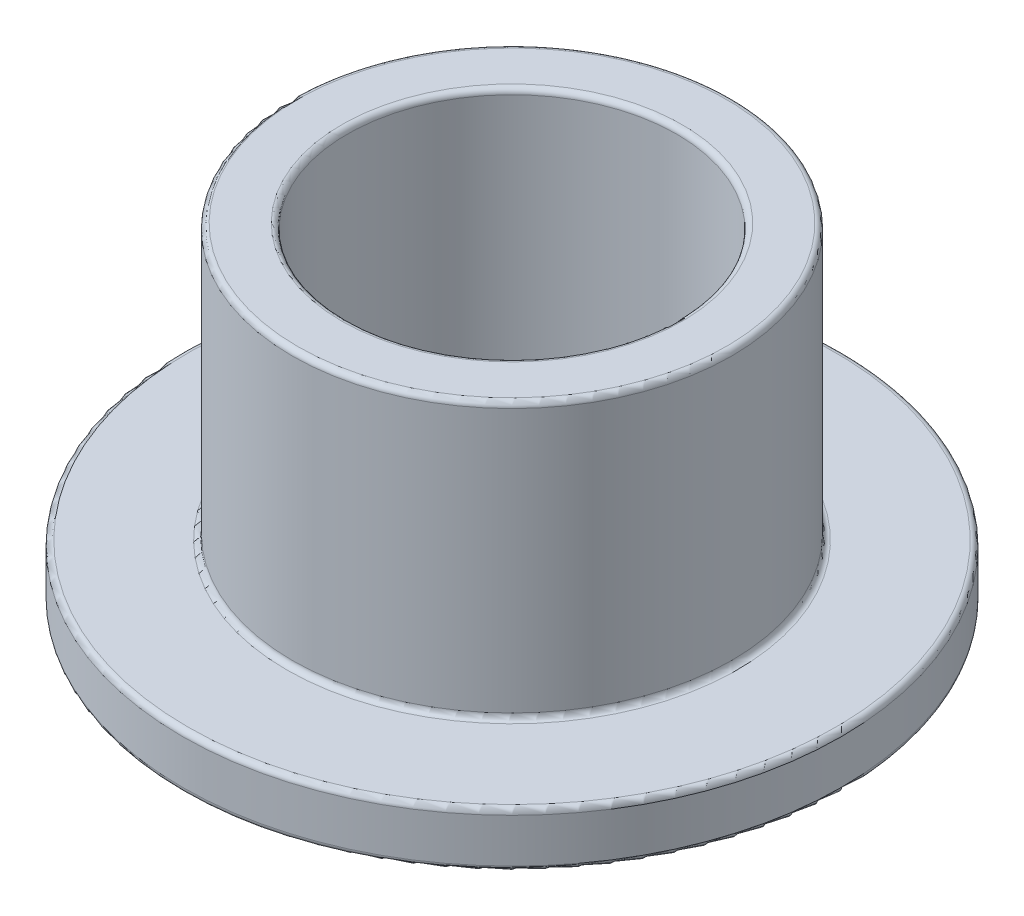
ISO-10303-21;
HEADER;
FILE_DESCRIPTION(('STEP AP214'),'2;1');
FILE_NAME('part.step','',(''),(''),'','','');
FILE_SCHEMA(('AUTOMOTIVE_DESIGN { 1 0 10303 214 1 1 1 1 }'));
ENDSEC;
DATA;
#1=APPLICATION_CONTEXT('core data for automotive mechanical design processes');
#2=APPLICATION_PROTOCOL_DEFINITION('international standard','automotive_design',2000,#1);
#3=PRODUCT_CONTEXT('',#1,'mechanical');
#4=PRODUCT('Part','Part','',(#3));
#5=PRODUCT_RELATED_PRODUCT_CATEGORY('part','',(#4));
#6=PRODUCT_DEFINITION_FORMATION('','',#4);
#7=PRODUCT_DEFINITION_CONTEXT('part definition',#1,'design');
#8=PRODUCT_DEFINITION('design','',#6,#7);
#9=PRODUCT_DEFINITION_SHAPE('','',#8);
#10=(LENGTH_UNIT() NAMED_UNIT(*) SI_UNIT(.MILLI.,.METRE.));
#11=(NAMED_UNIT(*) PLANE_ANGLE_UNIT() SI_UNIT($,.RADIAN.));
#12=(NAMED_UNIT(*) SI_UNIT($,.STERADIAN.) SOLID_ANGLE_UNIT());
#13=UNCERTAINTY_MEASURE_WITH_UNIT(LENGTH_MEASURE(1.E-05),#10,'distance_accuracy_value','');
#14=(GEOMETRIC_REPRESENTATION_CONTEXT(3) GLOBAL_UNCERTAINTY_ASSIGNED_CONTEXT((#13)) GLOBAL_UNIT_ASSIGNED_CONTEXT((#10,
#11,#12)) REPRESENTATION_CONTEXT('',''));
#15=CARTESIAN_POINT('',(0.,0.,0.));
#16=DIRECTION('',(0.,0.,1.));
#17=DIRECTION('',(1.,0.,0.));
#18=AXIS2_PLACEMENT_3D('',#15,#16,#17);
#19=CARTESIAN_POINT('',(0.,6.,0.));
#20=DIRECTION('',(0.,1.,0.));
#21=DIRECTION('',(0.,0.,1.));
#22=AXIS2_PLACEMENT_3D('',#19,#20,#21);
#23=PLANE('',#22);
#24=CARTESIAN_POINT('',(0.,6.,0.));
#25=DIRECTION('',(0.,1.,0.));
#26=DIRECTION('',(0.,0.,1.));
#27=AXIS2_PLACEMENT_3D('',#24,#25,#26);
#28=CIRCLE('',#27,3.1);
#29=CARTESIAN_POINT('',(0.,6.,3.1));
#30=VERTEX_POINT('',#29);
#31=EDGE_CURVE('E10',#30,#30,#28,.F.);
#32=ORIENTED_EDGE('',*,*,#31,.T.);
#33=EDGE_LOOP('',(#32));
#34=FACE_BOUND('',#33,.T.);
#35=CARTESIAN_POINT('',(0.,6.,0.));
#36=DIRECTION('',(0.,1.,0.));
#37=DIRECTION('',(0.,0.,1.));
#38=AXIS2_PLACEMENT_3D('',#35,#36,#37);
#39=CIRCLE('',#38,3.9);
#40=CARTESIAN_POINT('',(0.,6.,3.9));
#41=VERTEX_POINT('',#40);
#42=EDGE_CURVE('E52',#41,#41,#39,.T.);
#43=ORIENTED_EDGE('',*,*,#42,.T.);
#44=EDGE_LOOP('',(#43));
#45=FACE_BOUND('',#44,.T.);
#46=ADVANCED_FACE('F44',(#34,#45),#23,.T.);
#47=CARTESIAN_POINT('',(0.,0.,0.));
#48=DIRECTION('',(0.,1.,0.));
#49=DIRECTION('',(0.,0.,1.));
#50=AXIS2_PLACEMENT_3D('',#47,#48,#49);
#51=PLANE('',#50);
#52=CARTESIAN_POINT('',(0.,0.,0.));
#53=DIRECTION('',(0.,1.,0.));
#54=DIRECTION('',(0.,0.,1.));
#55=AXIS2_PLACEMENT_3D('',#52,#53,#54);
#56=CIRCLE('',#55,3.1);
#57=CARTESIAN_POINT('',(0.,0.,3.1));
#58=VERTEX_POINT('',#57);
#59=EDGE_CURVE('E94',#58,#58,#56,.T.);
#60=ORIENTED_EDGE('',*,*,#59,.T.);
#61=EDGE_LOOP('',(#60));
#62=FACE_BOUND('',#61,.T.);
#63=CARTESIAN_POINT('',(0.,0.,0.));
#64=DIRECTION('',(0.,1.,0.));
#65=DIRECTION('',(0.,0.,1.));
#66=AXIS2_PLACEMENT_3D('',#63,#64,#65);
#67=CIRCLE('',#66,5.9);
#68=CARTESIAN_POINT('',(0.,0.,5.9));
#69=VERTEX_POINT('',#68);
#70=EDGE_CURVE('E100',#69,#69,#67,.F.);
#71=ORIENTED_EDGE('',*,*,#70,.T.);
#72=EDGE_LOOP('',(#71));
#73=FACE_BOUND('',#72,.T.);
#74=ADVANCED_FACE('F102',(#62,#73),#51,.F.);
#75=CARTESIAN_POINT('',(0.,6.,0.));
#76=DIRECTION('',(0.,-1.,0.));
#77=DIRECTION('',(0.,0.,-1.));
#78=AXIS2_PLACEMENT_3D('',#75,#76,#77);
#79=CYLINDRICAL_SURFACE('',#78,4.);
#80=CARTESIAN_POINT('',(0.,1.1,0.));
#81=DIRECTION('',(0.,1.,0.));
#82=DIRECTION('',(0.,0.,1.));
#83=AXIS2_PLACEMENT_3D('',#80,#81,#82);
#84=CIRCLE('',#83,4.);
#85=CARTESIAN_POINT('',(0.,1.1,4.));
#86=VERTEX_POINT('',#85);
#87=EDGE_CURVE('E73',#86,#86,#84,.T.);
#88=ORIENTED_EDGE('',*,*,#87,.T.);
#89=EDGE_LOOP('',(#88));
#90=FACE_BOUND('',#89,.T.);
#91=CARTESIAN_POINT('',(0.,5.9,0.));
#92=DIRECTION('',(0.,1.,0.));
#93=DIRECTION('',(0.,0.,1.));
#94=AXIS2_PLACEMENT_3D('',#91,#92,#93);
#95=CIRCLE('',#94,4.);
#96=CARTESIAN_POINT('',(0.,5.9,4.));
#97=VERTEX_POINT('',#96);
#98=EDGE_CURVE('E71',#97,#97,#95,.F.);
#99=ORIENTED_EDGE('',*,*,#98,.T.);
#100=EDGE_LOOP('',(#99));
#101=FACE_BOUND('',#100,.T.);
#102=ADVANCED_FACE('F138',(#90,#101),#79,.T.);
#103=CARTESIAN_POINT('',(0.,6.,0.));
#104=DIRECTION('',(0.,-1.,0.));
#105=DIRECTION('',(0.,0.,-1.));
#106=AXIS2_PLACEMENT_3D('',#103,#104,#105);
#107=CYLINDRICAL_SURFACE('',#106,3.);
#108=CARTESIAN_POINT('',(0.,0.1,0.));
#109=DIRECTION('',(0.,1.,0.));
#110=DIRECTION('',(0.,0.,1.));
#111=AXIS2_PLACEMENT_3D('',#108,#109,#110);
#112=CIRCLE('',#111,3.);
#113=CARTESIAN_POINT('',(0.,0.1,3.));
#114=VERTEX_POINT('',#113);
#115=EDGE_CURVE('E87',#114,#114,#112,.F.);
#116=ORIENTED_EDGE('',*,*,#115,.T.);
#117=EDGE_LOOP('',(#116));
#118=FACE_BOUND('',#117,.T.);
#119=CARTESIAN_POINT('',(0.,5.9,0.));
#120=DIRECTION('',(0.,1.,0.));
#121=DIRECTION('',(0.,0.,1.));
#122=AXIS2_PLACEMENT_3D('',#119,#120,#121);
#123=CIRCLE('',#122,3.);
#124=CARTESIAN_POINT('',(0.,5.9,3.));
#125=VERTEX_POINT('',#124);
#126=EDGE_CURVE('E91',#125,#125,#123,.T.);
#127=ORIENTED_EDGE('',*,*,#126,.T.);
#128=EDGE_LOOP('',(#127));
#129=FACE_BOUND('',#128,.T.);
#130=ADVANCED_FACE('F127',(#118,#129),#107,.F.);
#131=CARTESIAN_POINT('',(0.,1.,0.));
#132=DIRECTION('',(0.,1.,0.));
#133=DIRECTION('',(0.,0.,1.));
#134=AXIS2_PLACEMENT_3D('',#131,#132,#133);
#135=PLANE('',#134);
#136=CARTESIAN_POINT('',(0.,1.,0.));
#137=DIRECTION('',(0.,1.,0.));
#138=DIRECTION('',(0.,0.,1.));
#139=AXIS2_PLACEMENT_3D('',#136,#137,#138);
#140=CIRCLE('',#139,4.1);
#141=CARTESIAN_POINT('',(0.,1.,4.1));
#142=VERTEX_POINT('',#141);
#143=EDGE_CURVE('E56',#142,#142,#140,.F.);
#144=ORIENTED_EDGE('',*,*,#143,.T.);
#145=EDGE_LOOP('',(#144));
#146=FACE_BOUND('',#145,.T.);
#147=CARTESIAN_POINT('',(0.,1.,0.));
#148=DIRECTION('',(0.,1.,0.));
#149=DIRECTION('',(0.,0.,1.));
#150=AXIS2_PLACEMENT_3D('',#147,#148,#149);
#151=CIRCLE('',#150,5.9);
#152=CARTESIAN_POINT('',(0.,1.,5.9));
#153=VERTEX_POINT('',#152);
#154=EDGE_CURVE('E62',#153,#153,#151,.T.);
#155=ORIENTED_EDGE('',*,*,#154,.T.);
#156=EDGE_LOOP('',(#155));
#157=FACE_BOUND('',#156,.T.);
#158=ADVANCED_FACE('F117',(#146,#157),#135,.T.);
#159=CARTESIAN_POINT('',(0.,1.,0.));
#160=DIRECTION('',(0.,-1.,0.));
#161=DIRECTION('',(0.,0.,-1.));
#162=AXIS2_PLACEMENT_3D('',#159,#160,#161);
#163=CYLINDRICAL_SURFACE('',#162,6.);
#164=CARTESIAN_POINT('',(0.,0.1,0.));
#165=DIRECTION('',(0.,1.,0.));
#166=DIRECTION('',(0.,0.,1.));
#167=AXIS2_PLACEMENT_3D('',#164,#165,#166);
#168=CIRCLE('',#167,6.);
#169=CARTESIAN_POINT('',(0.,0.1,6.));
#170=VERTEX_POINT('',#169);
#171=EDGE_CURVE('E79',#170,#170,#168,.T.);
#172=ORIENTED_EDGE('',*,*,#171,.T.);
#173=EDGE_LOOP('',(#172));
#174=FACE_BOUND('',#173,.T.);
#175=CARTESIAN_POINT('',(0.,0.9,0.));
#176=DIRECTION('',(0.,1.,0.));
#177=DIRECTION('',(0.,0.,1.));
#178=AXIS2_PLACEMENT_3D('',#175,#176,#177);
#179=CIRCLE('',#178,6.);
#180=CARTESIAN_POINT('',(0.,0.9,6.));
#181=VERTEX_POINT('',#180);
#182=EDGE_CURVE('E81',#181,#181,#179,.F.);
#183=ORIENTED_EDGE('',*,*,#182,.T.);
#184=EDGE_LOOP('',(#183));
#185=FACE_BOUND('',#184,.T.);
#186=ADVANCED_FACE('F114',(#174,#185),#163,.T.);
#187=CARTESIAN_POINT('',(0.,0.1,0.));
#188=DIRECTION('',(0.,1.,0.));
#189=DIRECTION('',(0.,0.,1.));
#190=AXIS2_PLACEMENT_3D('',#187,#188,#189);
#191=TOROIDAL_SURFACE('',#190,3.1,0.1);
#192=ORIENTED_EDGE('',*,*,#115,.F.);
#193=EDGE_LOOP('',(#192));
#194=FACE_BOUND('',#193,.T.);
#195=ORIENTED_EDGE('',*,*,#59,.F.);
#196=EDGE_LOOP('',(#195));
#197=FACE_BOUND('',#196,.T.);
#198=ADVANCED_FACE('F111',(#194,#197),#191,.T.);
#199=CARTESIAN_POINT('',(0.,0.1,0.));
#200=DIRECTION('',(0.,1.,0.));
#201=DIRECTION('',(0.,0.,1.));
#202=AXIS2_PLACEMENT_3D('',#199,#200,#201);
#203=TOROIDAL_SURFACE('',#202,5.9,0.1);
#204=ORIENTED_EDGE('',*,*,#70,.F.);
#205=EDGE_LOOP('',(#204));
#206=FACE_BOUND('',#205,.T.);
#207=ORIENTED_EDGE('',*,*,#171,.F.);
#208=EDGE_LOOP('',(#207));
#209=FACE_BOUND('',#208,.T.);
#210=ADVANCED_FACE('F110',(#206,#209),#203,.T.);
#211=CARTESIAN_POINT('',(0.,1.1,0.));
#212=DIRECTION('',(0.,1.,0.));
#213=DIRECTION('',(0.,0.,1.));
#214=AXIS2_PLACEMENT_3D('',#211,#212,#213);
#215=TOROIDAL_SURFACE('',#214,4.1,0.1);
#216=ORIENTED_EDGE('',*,*,#143,.F.);
#217=EDGE_LOOP('',(#216));
#218=FACE_BOUND('',#217,.T.);
#219=ORIENTED_EDGE('',*,*,#87,.F.);
#220=EDGE_LOOP('',(#219));
#221=FACE_BOUND('',#220,.T.);
#222=ADVANCED_FACE('F109',(#218,#221),#215,.F.);
#223=CARTESIAN_POINT('',(0.,0.9,0.));
#224=DIRECTION('',(0.,1.,0.));
#225=DIRECTION('',(0.,0.,1.));
#226=AXIS2_PLACEMENT_3D('',#223,#224,#225);
#227=TOROIDAL_SURFACE('',#226,5.9,0.1);
#228=ORIENTED_EDGE('',*,*,#182,.F.);
#229=EDGE_LOOP('',(#228));
#230=FACE_BOUND('',#229,.T.);
#231=ORIENTED_EDGE('',*,*,#154,.F.);
#232=EDGE_LOOP('',(#231));
#233=FACE_BOUND('',#232,.T.);
#234=ADVANCED_FACE('F125',(#230,#233),#227,.T.);
#235=CARTESIAN_POINT('',(0.,5.9,0.));
#236=DIRECTION('',(0.,1.,0.));
#237=DIRECTION('',(0.,0.,1.));
#238=AXIS2_PLACEMENT_3D('',#235,#236,#237);
#239=TOROIDAL_SURFACE('',#238,3.1,0.1);
#240=ORIENTED_EDGE('',*,*,#31,.F.);
#241=EDGE_LOOP('',(#240));
#242=FACE_BOUND('',#241,.T.);
#243=ORIENTED_EDGE('',*,*,#126,.F.);
#244=EDGE_LOOP('',(#243));
#245=FACE_BOUND('',#244,.T.);
#246=ADVANCED_FACE('F123',(#242,#245),#239,.T.);
#247=CARTESIAN_POINT('',(0.,5.9,0.));
#248=DIRECTION('',(0.,1.,0.));
#249=DIRECTION('',(0.,0.,1.));
#250=AXIS2_PLACEMENT_3D('',#247,#248,#249);
#251=TOROIDAL_SURFACE('',#250,3.9,0.1);
#252=ORIENTED_EDGE('',*,*,#98,.F.);
#253=EDGE_LOOP('',(#252));
#254=FACE_BOUND('',#253,.T.);
#255=ORIENTED_EDGE('',*,*,#42,.F.);
#256=EDGE_LOOP('',(#255));
#257=FACE_BOUND('',#256,.T.);
#258=ADVANCED_FACE('F50',(#254,#257),#251,.T.);
#259=CLOSED_SHELL('',(#46,#74,#102,#130,#158,#186,#198,#210,#222,#234,#246,#258));
#260=MANIFOLD_SOLID_BREP('B2',#259);
#261=ADVANCED_BREP_SHAPE_REPRESENTATION('',(#18,#260),#14);
#262=SHAPE_DEFINITION_REPRESENTATION(#9,#261);
ENDSEC;
END-ISO-10303-21;
